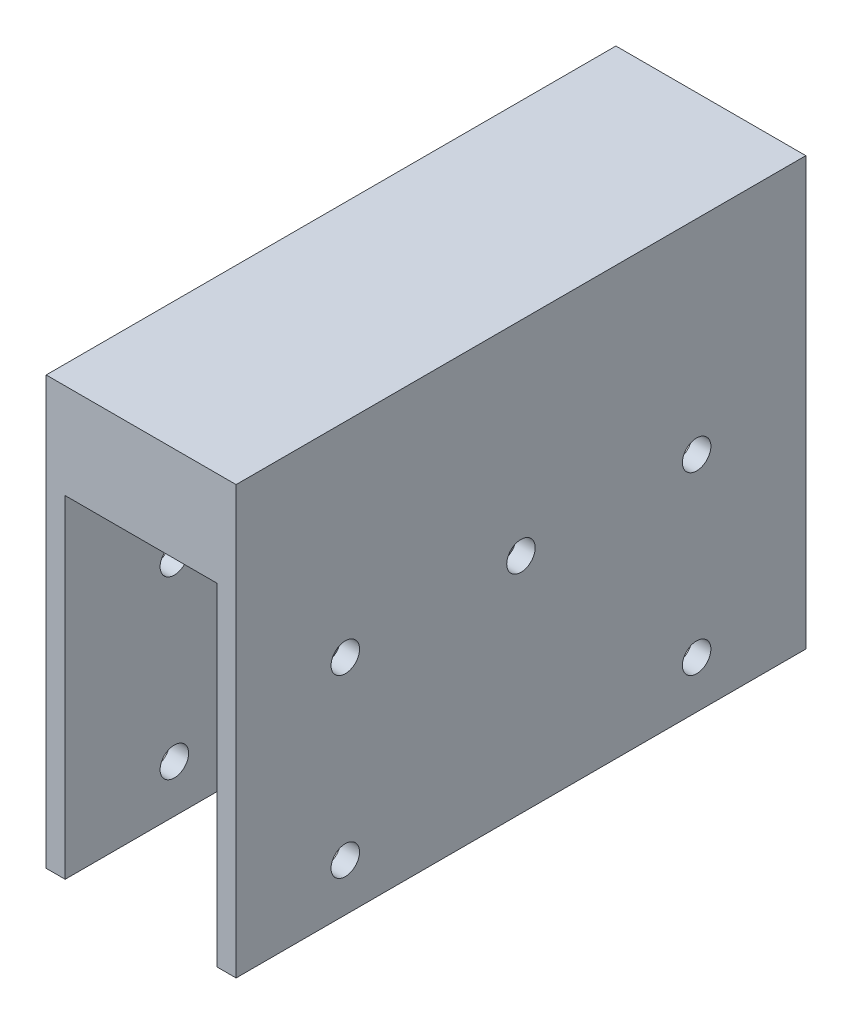
ISO-10303-21;
HEADER;
FILE_DESCRIPTION(('STEP AP214'),'2;1');
FILE_NAME('part.step','',(''),(''),'','','');
FILE_SCHEMA(('AUTOMOTIVE_DESIGN { 1 0 10303 214 1 1 1 1 }'));
ENDSEC;
DATA;
#1=APPLICATION_CONTEXT('core data for automotive mechanical design processes');
#2=APPLICATION_PROTOCOL_DEFINITION('international standard','automotive_design',2000,#1);
#3=PRODUCT_CONTEXT('',#1,'mechanical');
#4=PRODUCT('Part','Part','',(#3));
#5=PRODUCT_RELATED_PRODUCT_CATEGORY('part','',(#4));
#6=PRODUCT_DEFINITION_FORMATION('','',#4);
#7=PRODUCT_DEFINITION_CONTEXT('part definition',#1,'design');
#8=PRODUCT_DEFINITION('design','',#6,#7);
#9=PRODUCT_DEFINITION_SHAPE('','',#8);
#10=(LENGTH_UNIT() NAMED_UNIT(*) SI_UNIT(.MILLI.,.METRE.));
#11=(NAMED_UNIT(*) PLANE_ANGLE_UNIT() SI_UNIT($,.RADIAN.));
#12=(NAMED_UNIT(*) SI_UNIT($,.STERADIAN.) SOLID_ANGLE_UNIT());
#13=UNCERTAINTY_MEASURE_WITH_UNIT(LENGTH_MEASURE(1.E-05),#10,'distance_accuracy_value','');
#14=(GEOMETRIC_REPRESENTATION_CONTEXT(3) GLOBAL_UNCERTAINTY_ASSIGNED_CONTEXT((#13)) GLOBAL_UNIT_ASSIGNED_CONTEXT((#10,
#11,#12)) REPRESENTATION_CONTEXT('',''));
#15=CARTESIAN_POINT('',(0.,0.,0.));
#16=DIRECTION('',(0.,0.,1.));
#17=DIRECTION('',(1.,0.,0.));
#18=AXIS2_PLACEMENT_3D('',#15,#16,#17);
#19=CARTESIAN_POINT('',(-5.,-11.25,30.));
#20=DIRECTION('',(0.,1.,0.));
#21=DIRECTION('',(0.,0.,1.));
#22=AXIS2_PLACEMENT_3D('',#19,#20,#21);
#23=PLANE('',#22);
#24=DIRECTION('',(0.,0.,1.));
#25=VECTOR('',#24,1.);
#26=CARTESIAN_POINT('',(4.,-11.25,-0.001000000000001));
#27=LINE('',#26,#25);
#28=CARTESIAN_POINT('',(4.,-11.25,0.));
#29=VERTEX_POINT('',#28);
#30=CARTESIAN_POINT('',(4.,-11.25,30.));
#31=VERTEX_POINT('',#30);
#32=EDGE_CURVE('E134',#29,#31,#27,.T.);
#33=ORIENTED_EDGE('',*,*,#32,.F.);
#34=DIRECTION('',(1.,0.,0.));
#35=VECTOR('',#34,1.);
#36=CARTESIAN_POINT('',(-5.,-11.25,0.));
#37=LINE('',#36,#35);
#38=CARTESIAN_POINT('',(5.,-11.25,0.));
#39=VERTEX_POINT('',#38);
#40=EDGE_CURVE('E88',#29,#39,#37,.T.);
#41=ORIENTED_EDGE('',*,*,#40,.T.);
#42=DIRECTION('',(0.,0.,-1.));
#43=VECTOR('',#42,1.);
#44=CARTESIAN_POINT('',(5.,-11.25,30.));
#45=LINE('',#44,#43);
#46=CARTESIAN_POINT('',(5.,-11.25,30.));
#47=VERTEX_POINT('',#46);
#48=EDGE_CURVE('E171',#47,#39,#45,.T.);
#49=ORIENTED_EDGE('',*,*,#48,.F.);
#50=DIRECTION('',(1.,0.,0.));
#51=VECTOR('',#50,1.);
#52=CARTESIAN_POINT('',(-5.,-11.25,30.));
#53=LINE('',#52,#51);
#54=EDGE_CURVE('E62',#31,#47,#53,.T.);
#55=ORIENTED_EDGE('',*,*,#54,.F.);
#56=EDGE_LOOP('',(#33,#41,#49,#55));
#57=FACE_BOUND('',#56,.T.);
#58=ADVANCED_FACE('F43',(#57),#23,.F.);
#59=CARTESIAN_POINT('',(0.,0.,30.));
#60=DIRECTION('',(0.,0.,-1.));
#61=DIRECTION('',(-1.,0.,0.));
#62=AXIS2_PLACEMENT_3D('',#59,#60,#61);
#63=PLANE('',#62);
#64=DIRECTION('',(0.,-1.,0.));
#65=VECTOR('',#64,1.);
#66=CARTESIAN_POINT('',(4.,-11.25,30.));
#67=LINE('',#66,#65);
#68=CARTESIAN_POINT('',(4.,6.25,30.));
#69=VERTEX_POINT('',#68);
#70=EDGE_CURVE('E139',#69,#31,#67,.T.);
#71=ORIENTED_EDGE('',*,*,#70,.T.);
#72=ORIENTED_EDGE('',*,*,#54,.T.);
#73=DIRECTION('',(0.,1.,0.));
#74=VECTOR('',#73,1.);
#75=CARTESIAN_POINT('',(5.,-11.25,30.));
#76=LINE('',#75,#74);
#77=CARTESIAN_POINT('',(5.,11.25,30.));
#78=VERTEX_POINT('',#77);
#79=EDGE_CURVE('E162',#47,#78,#76,.T.);
#80=ORIENTED_EDGE('',*,*,#79,.T.);
#81=DIRECTION('',(-1.,0.,0.));
#82=VECTOR('',#81,1.);
#83=CARTESIAN_POINT('',(-5.,11.25,30.));
#84=LINE('',#83,#82);
#85=CARTESIAN_POINT('',(-5.,11.25,30.));
#86=VERTEX_POINT('',#85);
#87=EDGE_CURVE('E95',#78,#86,#84,.T.);
#88=ORIENTED_EDGE('',*,*,#87,.T.);
#89=DIRECTION('',(0.,-1.,0.));
#90=VECTOR('',#89,1.);
#91=CARTESIAN_POINT('',(-5.,-11.25,30.));
#92=LINE('',#91,#90);
#93=CARTESIAN_POINT('',(-5.,-11.25,30.));
#94=VERTEX_POINT('',#93);
#95=EDGE_CURVE('E166',#86,#94,#92,.T.);
#96=ORIENTED_EDGE('',*,*,#95,.T.);
#97=CARTESIAN_POINT('',(-4.,-11.25,30.));
#98=VERTEX_POINT('',#97);
#99=EDGE_CURVE('E168',#94,#98,#53,.T.);
#100=ORIENTED_EDGE('',*,*,#99,.T.);
#101=DIRECTION('',(0.,-1.,0.));
#102=VECTOR('',#101,1.);
#103=CARTESIAN_POINT('',(-4.,-11.25,30.));
#104=LINE('',#103,#102);
#105=CARTESIAN_POINT('',(-4.,6.25,30.));
#106=VERTEX_POINT('',#105);
#107=EDGE_CURVE('E153',#106,#98,#104,.T.);
#108=ORIENTED_EDGE('',*,*,#107,.F.);
#109=DIRECTION('',(-1.,0.,0.));
#110=VECTOR('',#109,1.);
#111=CARTESIAN_POINT('',(-4.,6.25,30.));
#112=LINE('',#111,#110);
#113=EDGE_CURVE('E155',#69,#106,#112,.T.);
#114=ORIENTED_EDGE('',*,*,#113,.F.);
#115=EDGE_LOOP('',(#71,#72,#80,#88,#96,#100,#108,#114));
#116=FACE_BOUND('',#115,.T.);
#117=ADVANCED_FACE('F245',(#116),#63,.F.);
#118=CARTESIAN_POINT('',(0.,0.,0.));
#119=DIRECTION('',(0.,0.,-1.));
#120=DIRECTION('',(-1.,0.,0.));
#121=AXIS2_PLACEMENT_3D('',#118,#119,#120);
#122=PLANE('',#121);
#123=ORIENTED_EDGE('',*,*,#40,.F.);
#124=DIRECTION('',(0.,-1.,0.));
#125=VECTOR('',#124,1.);
#126=CARTESIAN_POINT('',(4.,-11.25,0.));
#127=LINE('',#126,#125);
#128=CARTESIAN_POINT('',(4.,6.25,0.));
#129=VERTEX_POINT('',#128);
#130=EDGE_CURVE('E138',#129,#29,#127,.T.);
#131=ORIENTED_EDGE('',*,*,#130,.F.);
#132=DIRECTION('',(-1.,0.,0.));
#133=VECTOR('',#132,1.);
#134=CARTESIAN_POINT('',(-4.,6.25,0.));
#135=LINE('',#134,#133);
#136=CARTESIAN_POINT('',(-4.,6.25,0.));
#137=VERTEX_POINT('',#136);
#138=EDGE_CURVE('E123',#129,#137,#135,.T.);
#139=ORIENTED_EDGE('',*,*,#138,.T.);
#140=DIRECTION('',(0.,-1.,0.));
#141=VECTOR('',#140,1.);
#142=CARTESIAN_POINT('',(-4.,-11.25,0.));
#143=LINE('',#142,#141);
#144=CARTESIAN_POINT('',(-4.,-11.25,0.));
#145=VERTEX_POINT('',#144);
#146=EDGE_CURVE('E133',#137,#145,#143,.T.);
#147=ORIENTED_EDGE('',*,*,#146,.T.);
#148=CARTESIAN_POINT('',(-5.,-11.25,0.));
#149=VERTEX_POINT('',#148);
#150=EDGE_CURVE('E164',#149,#145,#37,.T.);
#151=ORIENTED_EDGE('',*,*,#150,.F.);
#152=DIRECTION('',(0.,-1.,0.));
#153=VECTOR('',#152,1.);
#154=CARTESIAN_POINT('',(-5.,-11.25,0.));
#155=LINE('',#154,#153);
#156=CARTESIAN_POINT('',(-5.,11.25,0.));
#157=VERTEX_POINT('',#156);
#158=EDGE_CURVE('E81',#157,#149,#155,.T.);
#159=ORIENTED_EDGE('',*,*,#158,.F.);
#160=DIRECTION('',(-1.,0.,0.));
#161=VECTOR('',#160,1.);
#162=CARTESIAN_POINT('',(-5.,11.25,0.));
#163=LINE('',#162,#161);
#164=CARTESIAN_POINT('',(5.,11.25,0.));
#165=VERTEX_POINT('',#164);
#166=EDGE_CURVE('E174',#165,#157,#163,.T.);
#167=ORIENTED_EDGE('',*,*,#166,.F.);
#168=DIRECTION('',(0.,1.,0.));
#169=VECTOR('',#168,1.);
#170=CARTESIAN_POINT('',(5.,-11.25,0.));
#171=LINE('',#170,#169);
#172=EDGE_CURVE('E159',#39,#165,#171,.T.);
#173=ORIENTED_EDGE('',*,*,#172,.F.);
#174=EDGE_LOOP('',(#123,#131,#139,#147,#151,#159,#167,#173));
#175=FACE_BOUND('',#174,.T.);
#176=ADVANCED_FACE('F141',(#175),#122,.T.);
#177=ORIENTED_EDGE('',*,*,#150,.T.);
#178=DIRECTION('',(0.,0.,1.));
#179=VECTOR('',#178,1.);
#180=CARTESIAN_POINT('',(-4.,-11.25,-0.001000000000001));
#181=LINE('',#180,#179);
#182=EDGE_CURVE('E157',#145,#98,#181,.T.);
#183=ORIENTED_EDGE('',*,*,#182,.T.);
#184=ORIENTED_EDGE('',*,*,#99,.F.);
#185=DIRECTION('',(0.,0.,-1.));
#186=VECTOR('',#185,1.);
#187=CARTESIAN_POINT('',(-5.,-11.25,30.));
#188=LINE('',#187,#186);
#189=EDGE_CURVE('E180',#94,#149,#188,.T.);
#190=ORIENTED_EDGE('',*,*,#189,.T.);
#191=EDGE_LOOP('',(#177,#183,#184,#190));
#192=FACE_BOUND('',#191,.T.);
#193=ADVANCED_FACE('F247',(#192),#23,.F.);
#194=CARTESIAN_POINT('',(5.,-11.25,30.));
#195=DIRECTION('',(-1.,0.,0.));
#196=DIRECTION('',(0.,0.,1.));
#197=AXIS2_PLACEMENT_3D('',#194,#195,#196);
#198=PLANE('',#197);
#199=CARTESIAN_POINT('',(5.,0.5,15.));
#200=DIRECTION('',(-1.,0.,0.));
#201=DIRECTION('',(0.,0.,1.));
#202=AXIS2_PLACEMENT_3D('',#199,#200,#201);
#203=CIRCLE('',#202,0.750000000000002);
#204=CARTESIAN_POINT('',(5.,0.5,15.75));
#205=VERTEX_POINT('',#204);
#206=EDGE_CURVE('E302',#205,#205,#203,.T.);
#207=ORIENTED_EDGE('',*,*,#206,.T.);
#208=EDGE_LOOP('',(#207));
#209=FACE_BOUND('',#208,.T.);
#210=CARTESIAN_POINT('',(5.,-8.75,24.25));
#211=DIRECTION('',(-1.,0.,0.));
#212=DIRECTION('',(0.,0.,1.));
#213=AXIS2_PLACEMENT_3D('',#210,#211,#212);
#214=CIRCLE('',#213,0.75);
#215=CARTESIAN_POINT('',(5.,-8.75,25.));
#216=VERTEX_POINT('',#215);
#217=EDGE_CURVE('E292',#216,#216,#214,.T.);
#218=ORIENTED_EDGE('',*,*,#217,.T.);
#219=EDGE_LOOP('',(#218));
#220=FACE_BOUND('',#219,.T.);
#221=CARTESIAN_POINT('',(5.,0.5,24.25));
#222=DIRECTION('',(-1.,0.,0.));
#223=DIRECTION('',(0.,0.,1.));
#224=AXIS2_PLACEMENT_3D('',#221,#222,#223);
#225=CIRCLE('',#224,0.749999999999998);
#226=CARTESIAN_POINT('',(5.,0.5,25.));
#227=VERTEX_POINT('',#226);
#228=EDGE_CURVE('E207',#227,#227,#225,.T.);
#229=ORIENTED_EDGE('',*,*,#228,.T.);
#230=EDGE_LOOP('',(#229));
#231=FACE_BOUND('',#230,.T.);
#232=CARTESIAN_POINT('',(5.,-8.75,5.75));
#233=DIRECTION('',(1.,0.,0.));
#234=DIRECTION('',(0.,0.,-1.));
#235=AXIS2_PLACEMENT_3D('',#232,#233,#234);
#236=CIRCLE('',#235,0.75);
#237=CARTESIAN_POINT('',(5.,-8.75,5.));
#238=VERTEX_POINT('',#237);
#239=EDGE_CURVE('E212',#238,#238,#236,.T.);
#240=ORIENTED_EDGE('',*,*,#239,.F.);
#241=EDGE_LOOP('',(#240));
#242=FACE_BOUND('',#241,.T.);
#243=CARTESIAN_POINT('',(5.,0.5,5.75));
#244=DIRECTION('',(1.,0.,0.));
#245=DIRECTION('',(0.,0.,-1.));
#246=AXIS2_PLACEMENT_3D('',#243,#244,#245);
#247=CIRCLE('',#246,0.749999999999998);
#248=CARTESIAN_POINT('',(5.,0.5,5.));
#249=VERTEX_POINT('',#248);
#250=EDGE_CURVE('E215',#249,#249,#247,.T.);
#251=ORIENTED_EDGE('',*,*,#250,.F.);
#252=EDGE_LOOP('',(#251));
#253=FACE_BOUND('',#252,.T.);
#254=ORIENTED_EDGE('',*,*,#172,.T.);
#255=DIRECTION('',(0.,0.,-1.));
#256=VECTOR('',#255,1.);
#257=CARTESIAN_POINT('',(5.,11.25,30.));
#258=LINE('',#257,#256);
#259=EDGE_CURVE('E11',#78,#165,#258,.T.);
#260=ORIENTED_EDGE('',*,*,#259,.F.);
#261=ORIENTED_EDGE('',*,*,#79,.F.);
#262=ORIENTED_EDGE('',*,*,#48,.T.);
#263=EDGE_LOOP('',(#254,#260,#261,#262));
#264=FACE_BOUND('',#263,.T.);
#265=ADVANCED_FACE('F45',(#209,#220,#231,#242,#253,#264),#198,.F.);
#266=CARTESIAN_POINT('',(-5.,11.25,30.));
#267=DIRECTION('',(0.,-1.,0.));
#268=DIRECTION('',(0.,0.,-1.));
#269=AXIS2_PLACEMENT_3D('',#266,#267,#268);
#270=PLANE('',#269);
#271=ORIENTED_EDGE('',*,*,#166,.T.);
#272=DIRECTION('',(0.,0.,-1.));
#273=VECTOR('',#272,1.);
#274=CARTESIAN_POINT('',(-5.,11.25,30.));
#275=LINE('',#274,#273);
#276=EDGE_CURVE('E53',#86,#157,#275,.T.);
#277=ORIENTED_EDGE('',*,*,#276,.F.);
#278=ORIENTED_EDGE('',*,*,#87,.F.);
#279=ORIENTED_EDGE('',*,*,#259,.T.);
#280=EDGE_LOOP('',(#271,#277,#278,#279));
#281=FACE_BOUND('',#280,.T.);
#282=ADVANCED_FACE('F260',(#281),#270,.F.);
#283=CARTESIAN_POINT('',(-5.,-11.25,30.));
#284=DIRECTION('',(1.,0.,0.));
#285=DIRECTION('',(0.,0.,-1.));
#286=AXIS2_PLACEMENT_3D('',#283,#284,#285);
#287=PLANE('',#286);
#288=CARTESIAN_POINT('',(-5.,0.5,15.));
#289=DIRECTION('',(-1.,0.,0.));
#290=DIRECTION('',(0.,0.,1.));
#291=AXIS2_PLACEMENT_3D('',#288,#289,#290);
#292=CIRCLE('',#291,0.750000000000002);
#293=CARTESIAN_POINT('',(-5.,0.5,15.75));
#294=VERTEX_POINT('',#293);
#295=EDGE_CURVE('E278',#294,#294,#292,.T.);
#296=ORIENTED_EDGE('',*,*,#295,.F.);
#297=EDGE_LOOP('',(#296));
#298=FACE_BOUND('',#297,.T.);
#299=CARTESIAN_POINT('',(-5.,-8.75,24.25));
#300=DIRECTION('',(-1.,0.,0.));
#301=DIRECTION('',(0.,0.,1.));
#302=AXIS2_PLACEMENT_3D('',#299,#300,#301);
#303=CIRCLE('',#302,0.75);
#304=CARTESIAN_POINT('',(-5.,-8.75,25.));
#305=VERTEX_POINT('',#304);
#306=EDGE_CURVE('E193',#305,#305,#303,.T.);
#307=ORIENTED_EDGE('',*,*,#306,.F.);
#308=EDGE_LOOP('',(#307));
#309=FACE_BOUND('',#308,.T.);
#310=CARTESIAN_POINT('',(-5.,0.5,24.25));
#311=DIRECTION('',(-1.,0.,0.));
#312=DIRECTION('',(0.,0.,1.));
#313=AXIS2_PLACEMENT_3D('',#310,#311,#312);
#314=CIRCLE('',#313,0.749999999999998);
#315=CARTESIAN_POINT('',(-5.,0.5,25.));
#316=VERTEX_POINT('',#315);
#317=EDGE_CURVE('E285',#316,#316,#314,.T.);
#318=ORIENTED_EDGE('',*,*,#317,.F.);
#319=EDGE_LOOP('',(#318));
#320=FACE_BOUND('',#319,.T.);
#321=CARTESIAN_POINT('',(-5.,-8.75,5.75));
#322=DIRECTION('',(1.,0.,0.));
#323=DIRECTION('',(0.,0.,-1.));
#324=AXIS2_PLACEMENT_3D('',#321,#322,#323);
#325=CIRCLE('',#324,0.75);
#326=CARTESIAN_POINT('',(-5.,-8.75,5.));
#327=VERTEX_POINT('',#326);
#328=EDGE_CURVE('E187',#327,#327,#325,.T.);
#329=ORIENTED_EDGE('',*,*,#328,.T.);
#330=EDGE_LOOP('',(#329));
#331=FACE_BOUND('',#330,.T.);
#332=CARTESIAN_POINT('',(-5.,0.5,5.75));
#333=DIRECTION('',(1.,0.,0.));
#334=DIRECTION('',(0.,0.,-1.));
#335=AXIS2_PLACEMENT_3D('',#332,#333,#334);
#336=CIRCLE('',#335,0.749999999999998);
#337=CARTESIAN_POINT('',(-5.,0.5,5.));
#338=VERTEX_POINT('',#337);
#339=EDGE_CURVE('E200',#338,#338,#336,.T.);
#340=ORIENTED_EDGE('',*,*,#339,.T.);
#341=EDGE_LOOP('',(#340));
#342=FACE_BOUND('',#341,.T.);
#343=ORIENTED_EDGE('',*,*,#158,.T.);
#344=ORIENTED_EDGE('',*,*,#189,.F.);
#345=ORIENTED_EDGE('',*,*,#95,.F.);
#346=ORIENTED_EDGE('',*,*,#276,.T.);
#347=EDGE_LOOP('',(#343,#344,#345,#346));
#348=FACE_BOUND('',#347,.T.);
#349=ADVANCED_FACE('F267',(#298,#309,#320,#331,#342,#348),#287,.F.);
#350=CARTESIAN_POINT('',(-4.,-11.25,-0.001000000000001));
#351=DIRECTION('',(-1.,0.,0.));
#352=DIRECTION('',(0.,0.,1.));
#353=AXIS2_PLACEMENT_3D('',#350,#351,#352);
#354=PLANE('',#353);
#355=CARTESIAN_POINT('',(-4.,0.5,15.));
#356=DIRECTION('',(-1.,0.,0.));
#357=DIRECTION('',(0.,0.,1.));
#358=AXIS2_PLACEMENT_3D('',#355,#356,#357);
#359=CIRCLE('',#358,0.750000000000002);
#360=CARTESIAN_POINT('',(-4.,0.5,15.75));
#361=VERTEX_POINT('',#360);
#362=EDGE_CURVE('E296',#361,#361,#359,.T.);
#363=ORIENTED_EDGE('',*,*,#362,.T.);
#364=EDGE_LOOP('',(#363));
#365=FACE_BOUND('',#364,.T.);
#366=CARTESIAN_POINT('',(-4.,-8.75,24.25));
#367=DIRECTION('',(-1.,0.,0.));
#368=DIRECTION('',(0.,0.,1.));
#369=AXIS2_PLACEMENT_3D('',#366,#367,#368);
#370=CIRCLE('',#369,0.75);
#371=CARTESIAN_POINT('',(-4.,-8.75,25.));
#372=VERTEX_POINT('',#371);
#373=EDGE_CURVE('E196',#372,#372,#370,.F.);
#374=ORIENTED_EDGE('',*,*,#373,.F.);
#375=EDGE_LOOP('',(#374));
#376=FACE_BOUND('',#375,.T.);
#377=CARTESIAN_POINT('',(-4.,0.5,24.25));
#378=DIRECTION('',(-1.,0.,0.));
#379=DIRECTION('',(0.,0.,1.));
#380=AXIS2_PLACEMENT_3D('',#377,#378,#379);
#381=CIRCLE('',#380,0.749999999999998);
#382=CARTESIAN_POINT('',(-4.,0.5,25.));
#383=VERTEX_POINT('',#382);
#384=EDGE_CURVE('E192',#383,#383,#381,.F.);
#385=ORIENTED_EDGE('',*,*,#384,.F.);
#386=EDGE_LOOP('',(#385));
#387=FACE_BOUND('',#386,.T.);
#388=CARTESIAN_POINT('',(-4.,-8.75,5.75));
#389=DIRECTION('',(-1.,0.,0.));
#390=DIRECTION('',(0.,0.,1.));
#391=AXIS2_PLACEMENT_3D('',#388,#389,#390);
#392=CIRCLE('',#391,0.75);
#393=CARTESIAN_POINT('',(-4.,-8.75,6.5));
#394=VERTEX_POINT('',#393);
#395=EDGE_CURVE('E143',#394,#394,#392,.T.);
#396=ORIENTED_EDGE('',*,*,#395,.T.);
#397=EDGE_LOOP('',(#396));
#398=FACE_BOUND('',#397,.T.);
#399=CARTESIAN_POINT('',(-4.,0.5,5.75));
#400=DIRECTION('',(-1.,0.,0.));
#401=DIRECTION('',(0.,0.,1.));
#402=AXIS2_PLACEMENT_3D('',#399,#400,#401);
#403=CIRCLE('',#402,0.749999999999998);
#404=CARTESIAN_POINT('',(-4.,0.5,6.5));
#405=VERTEX_POINT('',#404);
#406=EDGE_CURVE('E186',#405,#405,#403,.T.);
#407=ORIENTED_EDGE('',*,*,#406,.T.);
#408=EDGE_LOOP('',(#407));
#409=FACE_BOUND('',#408,.T.);
#410=DIRECTION('',(0.,0.,1.));
#411=VECTOR('',#410,1.);
#412=CARTESIAN_POINT('',(-4.,6.25,-0.001000000000001));
#413=LINE('',#412,#411);
#414=EDGE_CURVE('E129',#137,#106,#413,.T.);
#415=ORIENTED_EDGE('',*,*,#414,.T.);
#416=ORIENTED_EDGE('',*,*,#107,.T.);
#417=ORIENTED_EDGE('',*,*,#182,.F.);
#418=ORIENTED_EDGE('',*,*,#146,.F.);
#419=EDGE_LOOP('',(#415,#416,#417,#418));
#420=FACE_BOUND('',#419,.T.);
#421=ADVANCED_FACE('F222',(#365,#376,#387,#398,#409,#420),#354,.F.);
#422=CARTESIAN_POINT('',(-4.,6.25,-0.001000000000001));
#423=DIRECTION('',(0.,1.,0.));
#424=DIRECTION('',(0.,0.,1.));
#425=AXIS2_PLACEMENT_3D('',#422,#423,#424);
#426=PLANE('',#425);
#427=ORIENTED_EDGE('',*,*,#138,.F.);
#428=DIRECTION('',(0.,0.,1.));
#429=VECTOR('',#428,1.);
#430=CARTESIAN_POINT('',(4.,6.25,-0.001000000000001));
#431=LINE('',#430,#429);
#432=EDGE_CURVE('E127',#129,#69,#431,.T.);
#433=ORIENTED_EDGE('',*,*,#432,.T.);
#434=ORIENTED_EDGE('',*,*,#113,.T.);
#435=ORIENTED_EDGE('',*,*,#414,.F.);
#436=EDGE_LOOP('',(#427,#433,#434,#435));
#437=FACE_BOUND('',#436,.T.);
#438=ADVANCED_FACE('F125',(#437),#426,.F.);
#439=CARTESIAN_POINT('',(4.,-11.25,-0.001000000000001));
#440=DIRECTION('',(-1.,0.,0.));
#441=DIRECTION('',(0.,0.,1.));
#442=AXIS2_PLACEMENT_3D('',#439,#440,#441);
#443=PLANE('',#442);
#444=CARTESIAN_POINT('',(4.,0.5,15.));
#445=DIRECTION('',(-1.,0.,0.));
#446=DIRECTION('',(0.,0.,1.));
#447=AXIS2_PLACEMENT_3D('',#444,#445,#446);
#448=CIRCLE('',#447,0.750000000000002);
#449=CARTESIAN_POINT('',(4.,0.5,15.75));
#450=VERTEX_POINT('',#449);
#451=EDGE_CURVE('E47',#450,#450,#448,.T.);
#452=ORIENTED_EDGE('',*,*,#451,.F.);
#453=EDGE_LOOP('',(#452));
#454=FACE_BOUND('',#453,.T.);
#455=CARTESIAN_POINT('',(4.,-8.75,24.25));
#456=DIRECTION('',(-1.,0.,0.));
#457=DIRECTION('',(0.,0.,1.));
#458=AXIS2_PLACEMENT_3D('',#455,#456,#457);
#459=CIRCLE('',#458,0.75);
#460=CARTESIAN_POINT('',(4.,-8.75,25.));
#461=VERTEX_POINT('',#460);
#462=EDGE_CURVE('E194',#461,#461,#459,.F.);
#463=ORIENTED_EDGE('',*,*,#462,.T.);
#464=EDGE_LOOP('',(#463));
#465=FACE_BOUND('',#464,.T.);
#466=CARTESIAN_POINT('',(4.,0.5,24.25));
#467=DIRECTION('',(-1.,0.,0.));
#468=DIRECTION('',(0.,0.,1.));
#469=AXIS2_PLACEMENT_3D('',#466,#467,#468);
#470=CIRCLE('',#469,0.749999999999998);
#471=CARTESIAN_POINT('',(4.,0.5,25.));
#472=VERTEX_POINT('',#471);
#473=EDGE_CURVE('E190',#472,#472,#470,.F.);
#474=ORIENTED_EDGE('',*,*,#473,.T.);
#475=EDGE_LOOP('',(#474));
#476=FACE_BOUND('',#475,.T.);
#477=CARTESIAN_POINT('',(4.,-8.75,5.75));
#478=DIRECTION('',(-1.,0.,0.));
#479=DIRECTION('',(0.,0.,1.));
#480=AXIS2_PLACEMENT_3D('',#477,#478,#479);
#481=CIRCLE('',#480,0.75);
#482=CARTESIAN_POINT('',(4.,-8.75,6.5));
#483=VERTEX_POINT('',#482);
#484=EDGE_CURVE('E147',#483,#483,#481,.T.);
#485=ORIENTED_EDGE('',*,*,#484,.F.);
#486=EDGE_LOOP('',(#485));
#487=FACE_BOUND('',#486,.T.);
#488=CARTESIAN_POINT('',(4.,0.5,5.75));
#489=DIRECTION('',(-1.,0.,0.));
#490=DIRECTION('',(0.,0.,1.));
#491=AXIS2_PLACEMENT_3D('',#488,#489,#490);
#492=CIRCLE('',#491,0.749999999999998);
#493=CARTESIAN_POINT('',(4.,0.5,6.5));
#494=VERTEX_POINT('',#493);
#495=EDGE_CURVE('E183',#494,#494,#492,.T.);
#496=ORIENTED_EDGE('',*,*,#495,.F.);
#497=EDGE_LOOP('',(#496));
#498=FACE_BOUND('',#497,.T.);
#499=ORIENTED_EDGE('',*,*,#130,.T.);
#500=ORIENTED_EDGE('',*,*,#32,.T.);
#501=ORIENTED_EDGE('',*,*,#70,.F.);
#502=ORIENTED_EDGE('',*,*,#432,.F.);
#503=EDGE_LOOP('',(#499,#500,#501,#502));
#504=FACE_BOUND('',#503,.T.);
#505=ADVANCED_FACE('F137',(#454,#465,#476,#487,#498,#504),#443,.T.);
#506=CARTESIAN_POINT('',(-5.,0.5,5.75));
#507=DIRECTION('',(1.,0.,0.));
#508=DIRECTION('',(0.,0.,-1.));
#509=AXIS2_PLACEMENT_3D('',#506,#507,#508);
#510=CYLINDRICAL_SURFACE('',#509,0.749999999999998);
#511=ORIENTED_EDGE('',*,*,#495,.T.);
#512=EDGE_LOOP('',(#511));
#513=FACE_BOUND('',#512,.T.);
#514=ORIENTED_EDGE('',*,*,#250,.T.);
#515=EDGE_LOOP('',(#514));
#516=FACE_BOUND('',#515,.T.);
#517=ADVANCED_FACE('F231',(#513,#516),#510,.F.);
#518=CARTESIAN_POINT('',(-5.,-8.75,5.75));
#519=DIRECTION('',(1.,0.,0.));
#520=DIRECTION('',(0.,0.,-1.));
#521=AXIS2_PLACEMENT_3D('',#518,#519,#520);
#522=CYLINDRICAL_SURFACE('',#521,0.75);
#523=ORIENTED_EDGE('',*,*,#484,.T.);
#524=EDGE_LOOP('',(#523));
#525=FACE_BOUND('',#524,.T.);
#526=ORIENTED_EDGE('',*,*,#239,.T.);
#527=EDGE_LOOP('',(#526));
#528=FACE_BOUND('',#527,.T.);
#529=ADVANCED_FACE('F228',(#525,#528),#522,.F.);
#530=ORIENTED_EDGE('',*,*,#339,.F.);
#531=EDGE_LOOP('',(#530));
#532=FACE_BOUND('',#531,.T.);
#533=ORIENTED_EDGE('',*,*,#406,.F.);
#534=EDGE_LOOP('',(#533));
#535=FACE_BOUND('',#534,.T.);
#536=ADVANCED_FACE('F225',(#532,#535),#510,.F.);
#537=ORIENTED_EDGE('',*,*,#328,.F.);
#538=EDGE_LOOP('',(#537));
#539=FACE_BOUND('',#538,.T.);
#540=ORIENTED_EDGE('',*,*,#395,.F.);
#541=EDGE_LOOP('',(#540));
#542=FACE_BOUND('',#541,.T.);
#543=ADVANCED_FACE('F227',(#539,#542),#522,.F.);
#544=CARTESIAN_POINT('',(-5.,0.5,24.25));
#545=DIRECTION('',(1.,0.,0.));
#546=DIRECTION('',(0.,0.,-1.));
#547=AXIS2_PLACEMENT_3D('',#544,#545,#546);
#548=CYLINDRICAL_SURFACE('',#547,0.749999999999998);
#549=ORIENTED_EDGE('',*,*,#473,.F.);
#550=EDGE_LOOP('',(#549));
#551=FACE_BOUND('',#550,.T.);
#552=ORIENTED_EDGE('',*,*,#228,.F.);
#553=EDGE_LOOP('',(#552));
#554=FACE_BOUND('',#553,.T.);
#555=ADVANCED_FACE('F236',(#551,#554),#548,.F.);
#556=CARTESIAN_POINT('',(-5.,-8.75,24.25));
#557=DIRECTION('',(1.,0.,0.));
#558=DIRECTION('',(0.,0.,-1.));
#559=AXIS2_PLACEMENT_3D('',#556,#557,#558);
#560=CYLINDRICAL_SURFACE('',#559,0.75);
#561=ORIENTED_EDGE('',*,*,#462,.F.);
#562=EDGE_LOOP('',(#561));
#563=FACE_BOUND('',#562,.T.);
#564=ORIENTED_EDGE('',*,*,#217,.F.);
#565=EDGE_LOOP('',(#564));
#566=FACE_BOUND('',#565,.T.);
#567=ADVANCED_FACE('F330',(#563,#566),#560,.F.);
#568=ORIENTED_EDGE('',*,*,#317,.T.);
#569=EDGE_LOOP('',(#568));
#570=FACE_BOUND('',#569,.T.);
#571=ORIENTED_EDGE('',*,*,#384,.T.);
#572=EDGE_LOOP('',(#571));
#573=FACE_BOUND('',#572,.T.);
#574=ADVANCED_FACE('F332',(#570,#573),#548,.F.);
#575=ORIENTED_EDGE('',*,*,#306,.T.);
#576=EDGE_LOOP('',(#575));
#577=FACE_BOUND('',#576,.T.);
#578=ORIENTED_EDGE('',*,*,#373,.T.);
#579=EDGE_LOOP('',(#578));
#580=FACE_BOUND('',#579,.T.);
#581=ADVANCED_FACE('F340',(#577,#580),#560,.F.);
#582=CARTESIAN_POINT('',(5.,0.5,15.));
#583=DIRECTION('',(-1.,0.,0.));
#584=DIRECTION('',(0.,0.,1.));
#585=AXIS2_PLACEMENT_3D('',#582,#583,#584);
#586=CYLINDRICAL_SURFACE('',#585,0.750000000000002);
#587=ORIENTED_EDGE('',*,*,#451,.T.);
#588=EDGE_LOOP('',(#587));
#589=FACE_BOUND('',#588,.T.);
#590=ORIENTED_EDGE('',*,*,#206,.F.);
#591=EDGE_LOOP('',(#590));
#592=FACE_BOUND('',#591,.T.);
#593=ADVANCED_FACE('F308',(#589,#592),#586,.F.);
#594=ORIENTED_EDGE('',*,*,#295,.T.);
#595=EDGE_LOOP('',(#594));
#596=FACE_BOUND('',#595,.T.);
#597=ORIENTED_EDGE('',*,*,#362,.F.);
#598=EDGE_LOOP('',(#597));
#599=FACE_BOUND('',#598,.T.);
#600=ADVANCED_FACE('F349',(#596,#599),#586,.F.);
#601=CLOSED_SHELL('',(#58,#117,#176,#193,#265,#282,#349,#421,#438,#505,#517,#529,#536,#543,#555,
#567,#574,#581,#593,#600));
#602=MANIFOLD_SOLID_BREP('B2',#601);
#603=ADVANCED_BREP_SHAPE_REPRESENTATION('',(#18,#602),#14);
#604=SHAPE_DEFINITION_REPRESENTATION(#9,#603);
ENDSEC;
END-ISO-10303-21;
